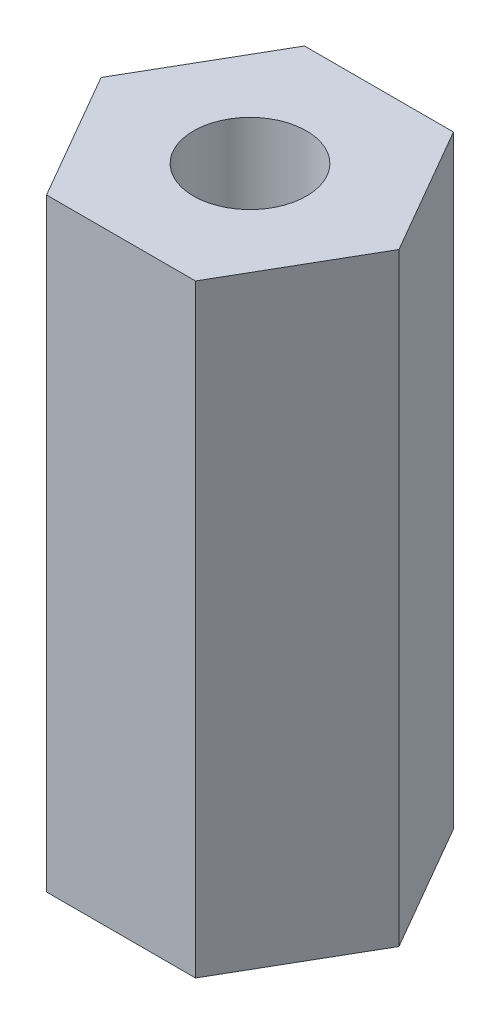
ISO-10303-21;
HEADER;
FILE_DESCRIPTION(('STEP AP214'),'2;1');
FILE_NAME('part.step','',(''),(''),'','','');
FILE_SCHEMA(('AUTOMOTIVE_DESIGN { 1 0 10303 214 1 1 1 1 }'));
ENDSEC;
DATA;
#1=APPLICATION_CONTEXT('core data for automotive mechanical design processes');
#2=APPLICATION_PROTOCOL_DEFINITION('international standard','automotive_design',2000,#1);
#3=PRODUCT_CONTEXT('',#1,'mechanical');
#4=PRODUCT('Part','Part','',(#3));
#5=PRODUCT_RELATED_PRODUCT_CATEGORY('part','',(#4));
#6=PRODUCT_DEFINITION_FORMATION('','',#4);
#7=PRODUCT_DEFINITION_CONTEXT('part definition',#1,'design');
#8=PRODUCT_DEFINITION('design','',#6,#7);
#9=PRODUCT_DEFINITION_SHAPE('','',#8);
#10=(LENGTH_UNIT() NAMED_UNIT(*) SI_UNIT(.MILLI.,.METRE.));
#11=(NAMED_UNIT(*) PLANE_ANGLE_UNIT() SI_UNIT($,.RADIAN.));
#12=(NAMED_UNIT(*) SI_UNIT($,.STERADIAN.) SOLID_ANGLE_UNIT());
#13=UNCERTAINTY_MEASURE_WITH_UNIT(LENGTH_MEASURE(1.E-05),#10,'distance_accuracy_value','');
#14=(GEOMETRIC_REPRESENTATION_CONTEXT(3) GLOBAL_UNCERTAINTY_ASSIGNED_CONTEXT((#13)) GLOBAL_UNIT_ASSIGNED_CONTEXT((#10,
#11,#12)) REPRESENTATION_CONTEXT('',''));
#15=CARTESIAN_POINT('',(0.,0.,0.));
#16=DIRECTION('',(0.,0.,1.));
#17=DIRECTION('',(1.,0.,0.));
#18=AXIS2_PLACEMENT_3D('',#15,#16,#17);
#19=CARTESIAN_POINT('',(1.35099962990375,10.95,2.33999999999999));
#20=DIRECTION('',(-0.866025403784441,0.,-0.499999999999995));
#21=DIRECTION('',(-0.499999999999995,0.,0.866025403784442));
#22=AXIS2_PLACEMENT_3D('',#19,#20,#21);
#23=PLANE('',#22);
#24=DIRECTION('',(0.499999999999995,0.,-0.866025403784442));
#25=VECTOR('',#24,1.);
#26=CARTESIAN_POINT('',(1.35099962990375,0.,2.33999999999999));
#27=LINE('',#26,#25);
#28=CARTESIAN_POINT('',(1.35099962990375,0.,2.33999999999999));
#29=VERTEX_POINT('',#28);
#30=CARTESIAN_POINT('',(2.70199925980745,0.,0.));
#31=VERTEX_POINT('',#30);
#32=EDGE_CURVE('E119',#29,#31,#27,.T.);
#33=ORIENTED_EDGE('',*,*,#32,.T.);
#34=DIRECTION('',(0.,-1.,0.));
#35=VECTOR('',#34,1.);
#36=CARTESIAN_POINT('',(2.70199925980745,10.95,0.));
#37=LINE('',#36,#35);
#38=CARTESIAN_POINT('',(2.70199925980745,10.95,0.));
#39=VERTEX_POINT('',#38);
#40=EDGE_CURVE('E11',#39,#31,#37,.T.);
#41=ORIENTED_EDGE('',*,*,#40,.F.);
#42=DIRECTION('',(0.499999999999995,0.,-0.866025403784442));
#43=VECTOR('',#42,1.);
#44=CARTESIAN_POINT('',(1.35099962990375,10.95,2.33999999999999));
#45=LINE('',#44,#43);
#46=CARTESIAN_POINT('',(1.35099962990375,10.95,2.33999999999999));
#47=VERTEX_POINT('',#46);
#48=EDGE_CURVE('E130',#47,#39,#45,.T.);
#49=ORIENTED_EDGE('',*,*,#48,.F.);
#50=DIRECTION('',(0.,-1.,0.));
#51=VECTOR('',#50,1.);
#52=CARTESIAN_POINT('',(1.35099962990375,10.95,2.33999999999999));
#53=LINE('',#52,#51);
#54=EDGE_CURVE('E115',#47,#29,#53,.T.);
#55=ORIENTED_EDGE('',*,*,#54,.T.);
#56=EDGE_LOOP('',(#33,#41,#49,#55));
#57=FACE_BOUND('',#56,.T.);
#58=ADVANCED_FACE('F35',(#57),#23,.F.);
#59=CARTESIAN_POINT('',(2.70199925980745,10.95,0.));
#60=DIRECTION('',(-0.866025403784438,0.,0.500000000000001));
#61=DIRECTION('',(0.500000000000001,0.,0.866025403784438));
#62=AXIS2_PLACEMENT_3D('',#59,#60,#61);
#63=PLANE('',#62);
#64=DIRECTION('',(-0.500000000000001,0.,-0.866025403784438));
#65=VECTOR('',#64,1.);
#66=CARTESIAN_POINT('',(2.70199925980745,0.,0.));
#67=LINE('',#66,#65);
#68=CARTESIAN_POINT('',(1.35099962990372,0.,-2.34000000000001));
#69=VERTEX_POINT('',#68);
#70=EDGE_CURVE('E122',#31,#69,#67,.T.);
#71=ORIENTED_EDGE('',*,*,#70,.T.);
#72=DIRECTION('',(0.,-1.,0.));
#73=VECTOR('',#72,1.);
#74=CARTESIAN_POINT('',(1.35099962990372,10.95,-2.34000000000001));
#75=LINE('',#74,#73);
#76=CARTESIAN_POINT('',(1.35099962990372,10.95,-2.34000000000001));
#77=VERTEX_POINT('',#76);
#78=EDGE_CURVE('E43',#77,#69,#75,.T.);
#79=ORIENTED_EDGE('',*,*,#78,.F.);
#80=DIRECTION('',(-0.500000000000001,0.,-0.866025403784438));
#81=VECTOR('',#80,1.);
#82=CARTESIAN_POINT('',(2.70199925980745,10.95,0.));
#83=LINE('',#82,#81);
#84=EDGE_CURVE('E88',#39,#77,#83,.T.);
#85=ORIENTED_EDGE('',*,*,#84,.F.);
#86=ORIENTED_EDGE('',*,*,#40,.T.);
#87=EDGE_LOOP('',(#71,#79,#85,#86));
#88=FACE_BOUND('',#87,.T.);
#89=ADVANCED_FACE('F155',(#88),#63,.F.);
#90=CARTESIAN_POINT('',(1.35099962990372,10.95,-2.34000000000001));
#91=DIRECTION('',(0.,0.,1.));
#92=DIRECTION('',(1.,0.,0.));
#93=AXIS2_PLACEMENT_3D('',#90,#91,#92);
#94=PLANE('',#93);
#95=DIRECTION('',(-1.,0.,0.));
#96=VECTOR('',#95,1.);
#97=CARTESIAN_POINT('',(1.35099962990372,0.,-2.34000000000001));
#98=LINE('',#97,#96);
#99=CARTESIAN_POINT('',(-1.35099962990374,0.,-2.34));
#100=VERTEX_POINT('',#99);
#101=EDGE_CURVE('E125',#69,#100,#98,.T.);
#102=ORIENTED_EDGE('',*,*,#101,.T.);
#103=DIRECTION('',(0.,-1.,0.));
#104=VECTOR('',#103,1.);
#105=CARTESIAN_POINT('',(-1.35099962990374,10.95,-2.34));
#106=LINE('',#105,#104);
#107=CARTESIAN_POINT('',(-1.35099962990374,10.95,-2.34));
#108=VERTEX_POINT('',#107);
#109=EDGE_CURVE('E110',#108,#100,#106,.T.);
#110=ORIENTED_EDGE('',*,*,#109,.F.);
#111=DIRECTION('',(-1.,0.,0.));
#112=VECTOR('',#111,1.);
#113=CARTESIAN_POINT('',(1.35099962990372,10.95,-2.34000000000001));
#114=LINE('',#113,#112);
#115=EDGE_CURVE('E101',#77,#108,#114,.T.);
#116=ORIENTED_EDGE('',*,*,#115,.F.);
#117=ORIENTED_EDGE('',*,*,#78,.T.);
#118=EDGE_LOOP('',(#102,#110,#116,#117));
#119=FACE_BOUND('',#118,.T.);
#120=ADVANCED_FACE('F136',(#119),#94,.F.);
#121=CARTESIAN_POINT('',(-1.35099962990374,10.95,-2.34));
#122=DIRECTION('',(0.866025403784441,0.,0.499999999999995));
#123=DIRECTION('',(0.499999999999995,0.,-0.866025403784442));
#124=AXIS2_PLACEMENT_3D('',#121,#122,#123);
#125=PLANE('',#124);
#126=DIRECTION('',(-0.499999999999995,0.,0.866025403784441));
#127=VECTOR('',#126,1.);
#128=CARTESIAN_POINT('',(-1.35099962990374,0.,-2.34));
#129=LINE('',#128,#127);
#130=CARTESIAN_POINT('',(-2.70199925980745,0.,0.));
#131=VERTEX_POINT('',#130);
#132=EDGE_CURVE('E109',#100,#131,#129,.T.);
#133=ORIENTED_EDGE('',*,*,#132,.T.);
#134=DIRECTION('',(0.,-1.,0.));
#135=VECTOR('',#134,1.);
#136=CARTESIAN_POINT('',(-2.70199925980745,10.95,0.));
#137=LINE('',#136,#135);
#138=CARTESIAN_POINT('',(-2.70199925980745,10.95,0.));
#139=VERTEX_POINT('',#138);
#140=EDGE_CURVE('E106',#139,#131,#137,.T.);
#141=ORIENTED_EDGE('',*,*,#140,.F.);
#142=DIRECTION('',(-0.499999999999995,0.,0.866025403784441));
#143=VECTOR('',#142,1.);
#144=CARTESIAN_POINT('',(-1.35099962990374,10.95,-2.34));
#145=LINE('',#144,#143);
#146=EDGE_CURVE('E95',#108,#139,#145,.T.);
#147=ORIENTED_EDGE('',*,*,#146,.F.);
#148=ORIENTED_EDGE('',*,*,#109,.T.);
#149=EDGE_LOOP('',(#133,#141,#147,#148));
#150=FACE_BOUND('',#149,.T.);
#151=ADVANCED_FACE('F107',(#150),#125,.F.);
#152=CARTESIAN_POINT('',(-2.70199925980745,10.95,0.));
#153=DIRECTION('',(0.866025403784435,0.,-0.500000000000007));
#154=DIRECTION('',(-0.500000000000007,0.,-0.866025403784435));
#155=AXIS2_PLACEMENT_3D('',#152,#153,#154);
#156=PLANE('',#155);
#157=DIRECTION('',(0.500000000000007,0.,0.866025403784435));
#158=VECTOR('',#157,1.);
#159=CARTESIAN_POINT('',(-2.70199925980745,0.,0.));
#160=LINE('',#159,#158);
#161=CARTESIAN_POINT('',(-1.3509996299037,0.,2.34000000000001));
#162=VERTEX_POINT('',#161);
#163=EDGE_CURVE('E74',#131,#162,#160,.T.);
#164=ORIENTED_EDGE('',*,*,#163,.T.);
#165=DIRECTION('',(0.,-1.,0.));
#166=VECTOR('',#165,1.);
#167=CARTESIAN_POINT('',(-1.3509996299037,10.95,2.34000000000001));
#168=LINE('',#167,#166);
#169=CARTESIAN_POINT('',(-1.3509996299037,10.95,2.34000000000001));
#170=VERTEX_POINT('',#169);
#171=EDGE_CURVE('E111',#170,#162,#168,.T.);
#172=ORIENTED_EDGE('',*,*,#171,.F.);
#173=DIRECTION('',(0.500000000000007,0.,0.866025403784435));
#174=VECTOR('',#173,1.);
#175=CARTESIAN_POINT('',(-2.70199925980745,10.95,0.));
#176=LINE('',#175,#174);
#177=EDGE_CURVE('E99',#139,#170,#176,.T.);
#178=ORIENTED_EDGE('',*,*,#177,.F.);
#179=ORIENTED_EDGE('',*,*,#140,.T.);
#180=EDGE_LOOP('',(#164,#172,#178,#179));
#181=FACE_BOUND('',#180,.T.);
#182=ADVANCED_FACE('F113',(#181),#156,.F.);
#183=CARTESIAN_POINT('',(-1.3509996299037,10.95,2.34000000000001));
#184=DIRECTION('',(0.,0.,-1.));
#185=DIRECTION('',(-1.,0.,0.));
#186=AXIS2_PLACEMENT_3D('',#183,#184,#185);
#187=PLANE('',#186);
#188=DIRECTION('',(1.,0.,0.));
#189=VECTOR('',#188,1.);
#190=CARTESIAN_POINT('',(-1.3509996299037,0.,2.34000000000001));
#191=LINE('',#190,#189);
#192=EDGE_CURVE('E80',#162,#29,#191,.T.);
#193=ORIENTED_EDGE('',*,*,#192,.T.);
#194=ORIENTED_EDGE('',*,*,#54,.F.);
#195=DIRECTION('',(1.,0.,0.));
#196=VECTOR('',#195,1.);
#197=CARTESIAN_POINT('',(-1.3509996299037,10.95,2.34000000000001));
#198=LINE('',#197,#196);
#199=EDGE_CURVE('E51',#170,#47,#198,.T.);
#200=ORIENTED_EDGE('',*,*,#199,.F.);
#201=ORIENTED_EDGE('',*,*,#171,.T.);
#202=EDGE_LOOP('',(#193,#194,#200,#201));
#203=FACE_BOUND('',#202,.T.);
#204=ADVANCED_FACE('F143',(#203),#187,.F.);
#205=CARTESIAN_POINT('',(0.,10.95,0.));
#206=DIRECTION('',(0.,1.,0.));
#207=DIRECTION('',(0.,0.,1.));
#208=AXIS2_PLACEMENT_3D('',#205,#206,#207);
#209=PLANE('',#208);
#210=CARTESIAN_POINT('',(0.,10.95,0.));
#211=DIRECTION('',(0.,1.,0.));
#212=DIRECTION('',(0.,0.,1.));
#213=AXIS2_PLACEMENT_3D('',#210,#211,#212);
#214=CIRCLE('',#213,1.025);
#215=CARTESIAN_POINT('',(0.,10.95,1.025));
#216=VERTEX_POINT('',#215);
#217=EDGE_CURVE('E210',#216,#216,#214,.T.);
#218=ORIENTED_EDGE('',*,*,#217,.F.);
#219=EDGE_LOOP('',(#218));
#220=FACE_BOUND('',#219,.T.);
#221=ORIENTED_EDGE('',*,*,#48,.T.);
#222=ORIENTED_EDGE('',*,*,#84,.T.);
#223=ORIENTED_EDGE('',*,*,#115,.T.);
#224=ORIENTED_EDGE('',*,*,#146,.T.);
#225=ORIENTED_EDGE('',*,*,#177,.T.);
#226=ORIENTED_EDGE('',*,*,#199,.T.);
#227=EDGE_LOOP('',(#221,#222,#223,#224,#225,#226));
#228=FACE_BOUND('',#227,.T.);
#229=ADVANCED_FACE('F97',(#220,#228),#209,.T.);
#230=CARTESIAN_POINT('',(0.,0.,0.));
#231=DIRECTION('',(0.,1.,0.));
#232=DIRECTION('',(0.,0.,1.));
#233=AXIS2_PLACEMENT_3D('',#230,#231,#232);
#234=PLANE('',#233);
#235=CARTESIAN_POINT('',(0.,0.,0.));
#236=DIRECTION('',(0.,1.,0.));
#237=DIRECTION('',(0.,0.,1.));
#238=AXIS2_PLACEMENT_3D('',#235,#236,#237);
#239=CIRCLE('',#238,1.025);
#240=CARTESIAN_POINT('',(0.,0.,1.025));
#241=VERTEX_POINT('',#240);
#242=EDGE_CURVE('E123',#241,#241,#239,.T.);
#243=ORIENTED_EDGE('',*,*,#242,.T.);
#244=EDGE_LOOP('',(#243));
#245=FACE_BOUND('',#244,.T.);
#246=ORIENTED_EDGE('',*,*,#32,.F.);
#247=ORIENTED_EDGE('',*,*,#192,.F.);
#248=ORIENTED_EDGE('',*,*,#163,.F.);
#249=ORIENTED_EDGE('',*,*,#132,.F.);
#250=ORIENTED_EDGE('',*,*,#101,.F.);
#251=ORIENTED_EDGE('',*,*,#70,.F.);
#252=EDGE_LOOP('',(#246,#247,#248,#249,#250,#251));
#253=FACE_BOUND('',#252,.T.);
#254=ADVANCED_FACE('F139',(#245,#253),#234,.F.);
#255=CARTESIAN_POINT('',(0.,10.95,0.));
#256=DIRECTION('',(0.,1.,0.));
#257=DIRECTION('',(0.,0.,1.));
#258=AXIS2_PLACEMENT_3D('',#255,#256,#257);
#259=CYLINDRICAL_SURFACE('',#258,1.025);
#260=ORIENTED_EDGE('',*,*,#242,.F.);
#261=EDGE_LOOP('',(#260));
#262=FACE_BOUND('',#261,.T.);
#263=ORIENTED_EDGE('',*,*,#217,.T.);
#264=EDGE_LOOP('',(#263));
#265=FACE_BOUND('',#264,.T.);
#266=ADVANCED_FACE('F192',(#262,#265),#259,.F.);
#267=CLOSED_SHELL('',(#58,#89,#120,#151,#182,#204,#229,#254,#266));
#268=MANIFOLD_SOLID_BREP('B2',#267);
#269=ADVANCED_BREP_SHAPE_REPRESENTATION('',(#18,#268),#14);
#270=SHAPE_DEFINITION_REPRESENTATION(#9,#269);
ENDSEC;
END-ISO-10303-21;
